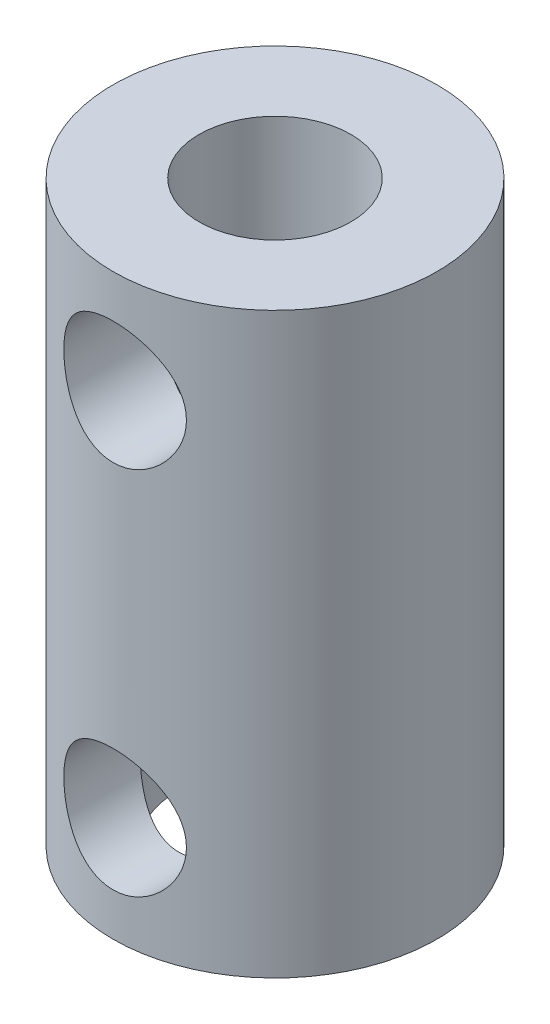
ISO-10303-21;
HEADER;
FILE_DESCRIPTION(('STEP AP214'),'2;1');
FILE_NAME('part.step','',(''),(''),'','','');
FILE_SCHEMA(('AUTOMOTIVE_DESIGN { 1 0 10303 214 1 1 1 1 }'));
ENDSEC;
DATA;
#1=APPLICATION_CONTEXT('core data for automotive mechanical design processes');
#2=APPLICATION_PROTOCOL_DEFINITION('international standard','automotive_design',2000,#1);
#3=PRODUCT_CONTEXT('',#1,'mechanical');
#4=PRODUCT('Part','Part','',(#3));
#5=PRODUCT_RELATED_PRODUCT_CATEGORY('part','',(#4));
#6=PRODUCT_DEFINITION_FORMATION('','',#4);
#7=PRODUCT_DEFINITION_CONTEXT('part definition',#1,'design');
#8=PRODUCT_DEFINITION('design','',#6,#7);
#9=PRODUCT_DEFINITION_SHAPE('','',#8);
#10=(LENGTH_UNIT() NAMED_UNIT(*) SI_UNIT(.MILLI.,.METRE.));
#11=(NAMED_UNIT(*) PLANE_ANGLE_UNIT() SI_UNIT($,.RADIAN.));
#12=(NAMED_UNIT(*) SI_UNIT($,.STERADIAN.) SOLID_ANGLE_UNIT());
#13=UNCERTAINTY_MEASURE_WITH_UNIT(LENGTH_MEASURE(1.E-05),#10,'distance_accuracy_value','');
#14=(GEOMETRIC_REPRESENTATION_CONTEXT(3) GLOBAL_UNCERTAINTY_ASSIGNED_CONTEXT((#13)) GLOBAL_UNIT_ASSIGNED_CONTEXT((#10,
#11,#12)) REPRESENTATION_CONTEXT('',''));
#15=CARTESIAN_POINT('',(0.,0.,0.));
#16=DIRECTION('',(0.,0.,1.));
#17=DIRECTION('',(1.,0.,0.));
#18=AXIS2_PLACEMENT_3D('',#15,#16,#17);
#19=CARTESIAN_POINT('',(0.,19.05,0.));
#20=DIRECTION('',(0.,-1.,0.));
#21=DIRECTION('',(0.,0.,-1.));
#22=AXIS2_PLACEMENT_3D('',#19,#20,#21);
#23=CYLINDRICAL_SURFACE('',#22,5.334);
#24=CARTESIAN_POINT('',(2.01929999999999,3.429,4.93700146951568));
#25=CARTESIAN_POINT('',(2.01930447944565,3.53796644205671,4.93699724405046));
#26=CARTESIAN_POINT('',(2.01045059439056,3.64690370553361,4.94064814854933));
#27=CARTESIAN_POINT('',(1.97543444054489,3.86148882864372,4.95475201963925));
#28=CARTESIAN_POINT('',(1.94927294682313,3.96713683535452,4.96520468163385));
#29=CARTESIAN_POINT('',(1.88074304619809,4.17198278347489,4.99156194094386));
#30=CARTESIAN_POINT('',(1.83841414033231,4.2711957615293,5.00745324054417));
#31=CARTESIAN_POINT('',(1.73889128334471,4.46115102344321,5.04287560500619));
#32=CARTESIAN_POINT('',(1.6816927775262,4.55189070025616,5.06240778458365));
#33=CARTESIAN_POINT('',(1.55095007886271,4.7269220295397,5.10401994332031));
#34=CARTESIAN_POINT('',(1.47677408325426,4.81072382075372,5.12617585427608));
#35=CARTESIAN_POINT('',(1.31552180232292,4.96504478705856,5.16990629793248));
#36=CARTESIAN_POINT('',(1.2284427045076,5.0355610586704,5.19148070266726));
#37=CARTESIAN_POINT('',(1.04012523794396,5.16368183766763,5.23252204526852));
#38=CARTESIAN_POINT('',(0.938499803257827,5.22075210244006,5.25188961400418));
#39=CARTESIAN_POINT('',(0.726227423158126,5.31678227445568,5.28542063488425));
#40=CARTESIAN_POINT('',(0.615583687488662,5.35574859235797,5.29958592879611));
#41=CARTESIAN_POINT('',(0.393566749542693,5.41274137724498,5.32057718322424));
#42=CARTESIAN_POINT('',(0.282438553669896,5.43161158643117,5.32769789450095));
#43=CARTESIAN_POINT('',(0.0583798398278733,5.45058184692518,5.33485652895422));
#44=CARTESIAN_POINT('',(-0.0545500684528993,5.45068811853213,5.33489679931724));
#45=CARTESIAN_POINT('',(-0.272951762873949,5.43261481136873,5.32807636219454));
#46=CARTESIAN_POINT('',(-0.378512558081566,5.41535666378981,5.32156339727964));
#47=CARTESIAN_POINT('',(-0.585111251091154,5.36459681820008,5.30282614548131));
#48=CARTESIAN_POINT('',(-0.686148827388547,5.33109396753274,5.29060145331974));
#49=CARTESIAN_POINT('',(-0.882591199788239,5.24837714092316,5.26142589156488));
#50=CARTESIAN_POINT('',(-0.977891853376849,5.19894029486581,5.24440843901689));
#51=CARTESIAN_POINT('',(-1.15908281530852,5.08595760716204,5.20736477295068));
#52=CARTESIAN_POINT('',(-1.24497004337341,5.02240716770396,5.18733757963256));
#53=CARTESIAN_POINT('',(-1.41031734945089,4.87858128309122,5.14492730665769));
#54=CARTESIAN_POINT('',(-1.48909060289719,4.79753549367529,5.12247495361345));
#55=CARTESIAN_POINT('',(-1.63218972233639,4.62325577623301,5.07869327063848));
#56=CARTESIAN_POINT('',(-1.69651181554814,4.53001867543433,5.05736423508365));
#57=CARTESIAN_POINT('',(-1.81023010786301,4.33124303399592,5.01780263958016));
#58=CARTESIAN_POINT('',(-1.85924901990288,4.22547089829707,4.99965257367589));
#59=CARTESIAN_POINT('',(-1.93851753880741,4.00630460921826,4.96945937974622));
#60=CARTESIAN_POINT('',(-1.96877783080307,3.89291483581017,4.95741277583277));
#61=CARTESIAN_POINT('',(-2.0080927254921,3.66852916571396,4.94161372576153));
#62=CARTESIAN_POINT('',(-2.01824049485177,3.55775511724918,4.93743437273379));
#63=CARTESIAN_POINT('',(-2.02020093934924,3.33603239846786,4.93663342024542));
#64=CARTESIAN_POINT('',(-2.01201832383527,3.22508378031911,4.94000987958409));
#65=CARTESIAN_POINT('',(-1.97854205652086,3.01183186914766,4.95350589275915));
#66=CARTESIAN_POINT('',(-1.95410194104481,2.90937078397479,4.96328872527596));
#67=CARTESIAN_POINT('',(-1.88988298600506,2.71005348440489,4.98809328378995));
#68=CARTESIAN_POINT('',(-1.85010096750629,2.61319843639933,5.00311609548081));
#69=CARTESIAN_POINT('',(-1.75463072385412,2.42375373533398,5.03740860205377));
#70=CARTESIAN_POINT('',(-1.69839621410485,2.3314653892027,5.05681781536739));
#71=CARTESIAN_POINT('',(-1.57219523321136,2.15724747101338,5.09746480725639));
#72=CARTESIAN_POINT('',(-1.50222365366067,2.07532177120689,5.11870326441882));
#73=CARTESIAN_POINT('',(-1.34516894631352,1.91864380219287,5.16227937258415));
#74=CARTESIAN_POINT('',(-1.25727058071108,1.84470087388889,5.18459902436317));
#75=CARTESIAN_POINT('',(-1.06976739053702,1.71251372859965,5.22650650196036));
#76=CARTESIAN_POINT('',(-0.970162473418255,1.65426963573486,5.24609430617899));
#77=CARTESIAN_POINT('',(-0.762084546055993,1.55549649159357,5.28032694944767));
#78=CARTESIAN_POINT('',(-0.65363967819728,1.51491364331945,5.29498676788628));
#79=CARTESIAN_POINT('',(-0.430779322695874,1.45280032542776,5.31775366325145));
#80=CARTESIAN_POINT('',(-0.316366729446474,1.43126070903253,5.32586388589443));
#81=CARTESIAN_POINT('',(-0.0921269840688143,1.40884562792458,5.33431446661301));
#82=CARTESIAN_POINT('',(0.0175700260696666,1.40682107157147,5.33508685186249));
#83=CARTESIAN_POINT('',(0.23567589035579,1.42052681410102,5.32990684279753));
#84=CARTESIAN_POINT('',(0.344084903230242,1.43625490180729,5.32395528598201));
#85=CARTESIAN_POINT('',(0.553754325491232,1.48421010250464,5.3061959436016));
#86=CARTESIAN_POINT('',(0.655126105044459,1.5160107376975,5.29453976881732));
#87=CARTESIAN_POINT('',(0.851099804673821,1.594780504935,5.26659215506921));
#88=CARTESIAN_POINT('',(0.945700438435498,1.64175250979098,5.2502998382871));
#89=CARTESIAN_POINT('',(1.12984126460486,1.75179421046231,5.21384686801513));
#90=CARTESIAN_POINT('',(1.21899691290268,1.81546192263802,5.19355150342232));
#91=CARTESIAN_POINT('',(1.38571137675006,1.9561510808879,5.15157869080139));
#92=CARTESIAN_POINT('',(1.46326600313846,2.03317732918966,5.1299007475314));
#93=CARTESIAN_POINT('',(1.60889417238222,2.20334295835456,5.08616858438968));
#94=CARTESIAN_POINT('',(1.67622898493519,2.29712810269221,5.06415732477682));
#95=CARTESIAN_POINT('',(1.79422016325732,2.49537615296483,5.02356822261871));
#96=CARTESIAN_POINT('',(1.84487417660335,2.59984056223187,5.0049908645041));
#97=CARTESIAN_POINT('',(1.92989734602869,2.82239312636753,4.97285117373348));
#98=CARTESIAN_POINT('',(1.96328114135574,2.94090744590317,4.9596003647767));
#99=CARTESIAN_POINT('',(2.00797225124147,3.18262915575414,4.94168088836879));
#100=CARTESIAN_POINT('',(2.01929493679981,3.30583321744351,4.93700624563709));
#101=CARTESIAN_POINT('',(2.01929999999999,3.429,4.93700146951568));
#102=B_SPLINE_CURVE_WITH_KNOTS('',3,(#24,#25,#26,#27,#28,#29,#30,#31,#32,#33,#34,#35,#36,#37,
#38,#39,#40,#41,#42,#43,#44,#45,#46,#47,#48,#49,#50,#51,#52,#53,#54,#55,#56,#57,#58,#59,#60,#61,
#62,#63,#64,#65,#66,#67,#68,#69,#70,#71,#72,#73,#74,#75,#76,#77,#78,#79,#80,#81,#82,#83,#84,#85,
#86,#87,#88,#89,#90,#91,#92,#93,#94,#95,#96,#97,#98,#99,#100,#101),.UNSPECIFIED.,.T.,.F.,(4,2,2,
2,2,2,2,2,2,2,2,2,2,2,2,2,2,2,2,2,2,2,2,2,2,2,2,2,2,2,2,2,2,2,2,2,2,2,4),(0.,0.326440462933104,
0.652866308208239,0.97849966296616,1.30423288001533,1.64497726295524,1.98579602758814,
2.33846601182069,2.69101101924979,3.02808777213957,3.36505278290879,3.68503301877184,
4.00503596242417,4.32972461584071,4.65451919925019,4.99864582719999,5.34286219255829,
5.69499486283583,6.0469267694459,6.37913973630183,6.71126736249901,7.02720512429604,
7.34320838551137,7.67120245546789,7.99931872846166,8.3487060328166,8.69809609946859,
9.04641432838319,9.39456516328478,9.72208120206034,10.0495564516543,10.3687657960398,
10.6880356205532,11.0208403418839,11.3537649513074,11.7046787209908,12.0556419573988,
12.4248810015916,12.793862687667),.UNSPECIFIED.);
#103=CARTESIAN_POINT('',(2.01929999999999,3.429,4.93700146951568));
#104=VERTEX_POINT('',#103);
#105=EDGE_CURVE('E143',#104,#104,#102,.T.);
#106=ORIENTED_EDGE('',*,*,#105,.F.);
#107=EDGE_LOOP('',(#106));
#108=FACE_BOUND('',#107,.T.);
#109=CARTESIAN_POINT('',(2.01929999999999,15.621,4.93700146951568));
#110=CARTESIAN_POINT('',(2.01930447944565,15.7299664420567,4.93699724405046));
#111=CARTESIAN_POINT('',(2.01045059439056,15.8389037055336,4.94064814854933));
#112=CARTESIAN_POINT('',(1.97543444054489,16.0534888286437,4.95475201963925));
#113=CARTESIAN_POINT('',(1.94927294682313,16.1591368353545,4.96520468163385));
#114=CARTESIAN_POINT('',(1.88074304619809,16.3639827834749,4.99156194094386));
#115=CARTESIAN_POINT('',(1.83841414033231,16.4631957615293,5.00745324054417));
#116=CARTESIAN_POINT('',(1.73889128334471,16.6531510234432,5.04287560500619));
#117=CARTESIAN_POINT('',(1.68169277752621,16.7438907002562,5.06240778458365));
#118=CARTESIAN_POINT('',(1.55095007886271,16.9189220295397,5.1040199433203));
#119=CARTESIAN_POINT('',(1.47677408325426,17.0027238207537,5.12617585427608));
#120=CARTESIAN_POINT('',(1.31552180232293,17.1570447870586,5.16990629793248));
#121=CARTESIAN_POINT('',(1.22844270450761,17.2275610586704,5.19148070266726));
#122=CARTESIAN_POINT('',(1.04012523794396,17.3556818376676,5.23252204526852));
#123=CARTESIAN_POINT('',(0.938499803257828,17.4127521024401,5.25188961400418));
#124=CARTESIAN_POINT('',(0.726227423158127,17.5087822744557,5.28542063488425));
#125=CARTESIAN_POINT('',(0.615583687488664,17.547748592358,5.29958592879611));
#126=CARTESIAN_POINT('',(0.393566749542695,17.604741377245,5.32057718322424));
#127=CARTESIAN_POINT('',(0.282438553669898,17.6236115864312,5.32769789450094));
#128=CARTESIAN_POINT('',(0.0583798398278744,17.6425818469252,5.33485652895422));
#129=CARTESIAN_POINT('',(-0.0545500684528987,17.6426881185321,5.33489679931724));
#130=CARTESIAN_POINT('',(-0.272951762873949,17.6246148113687,5.32807636219454));
#131=CARTESIAN_POINT('',(-0.378512558081566,17.6073566637898,5.32156339727964));
#132=CARTESIAN_POINT('',(-0.585111251091155,17.5565968182001,5.30282614548131));
#133=CARTESIAN_POINT('',(-0.686148827388547,17.5230939675327,5.29060145331974));
#134=CARTESIAN_POINT('',(-0.882591199788239,17.4403771409232,5.26142589156488));
#135=CARTESIAN_POINT('',(-0.977891853376849,17.3909402948658,5.24440843901689));
#136=CARTESIAN_POINT('',(-1.15908281530852,17.277957607162,5.20736477295068));
#137=CARTESIAN_POINT('',(-1.24497004337341,17.214407167704,5.18733757963256));
#138=CARTESIAN_POINT('',(-1.41031734945089,17.0705812830912,5.14492730665769));
#139=CARTESIAN_POINT('',(-1.48909060289719,16.9895354936753,5.12247495361345));
#140=CARTESIAN_POINT('',(-1.63218972233639,16.815255776233,5.07869327063848));
#141=CARTESIAN_POINT('',(-1.69651181554814,16.7220186754343,5.05736423508365));
#142=CARTESIAN_POINT('',(-1.81023010786301,16.5232430339959,5.01780263958016));
#143=CARTESIAN_POINT('',(-1.85924901990288,16.4174708982971,4.99965257367589));
#144=CARTESIAN_POINT('',(-1.93851753880741,16.1983046092183,4.96945937974622));
#145=CARTESIAN_POINT('',(-1.96877783080307,16.0849148358102,4.95741277583277));
#146=CARTESIAN_POINT('',(-2.0080927254921,15.860529165714,4.94161372576153));
#147=CARTESIAN_POINT('',(-2.01824049485177,15.7497551172492,4.93743437273379));
#148=CARTESIAN_POINT('',(-2.02020093934924,15.5280323984679,4.93663342024542));
#149=CARTESIAN_POINT('',(-2.01201832383527,15.4170837803191,4.94000987958409));
#150=CARTESIAN_POINT('',(-1.97854205652086,15.2038318691477,4.95350589275915));
#151=CARTESIAN_POINT('',(-1.95410194104481,15.1013707839748,4.96328872527596));
#152=CARTESIAN_POINT('',(-1.88988298600506,14.9020534844049,4.98809328378994));
#153=CARTESIAN_POINT('',(-1.85010096750629,14.8051984363993,5.00311609548081));
#154=CARTESIAN_POINT('',(-1.75463072385412,14.615753735334,5.03740860205377));
#155=CARTESIAN_POINT('',(-1.69839621410485,14.5234653892027,5.05681781536739));
#156=CARTESIAN_POINT('',(-1.57219523321136,14.3492474710134,5.09746480725639));
#157=CARTESIAN_POINT('',(-1.50222365366067,14.2673217712069,5.11870326441882));
#158=CARTESIAN_POINT('',(-1.34516894631352,14.1106438021929,5.16227937258415));
#159=CARTESIAN_POINT('',(-1.25727058071108,14.0367008738889,5.18459902436317));
#160=CARTESIAN_POINT('',(-1.06976739053702,13.9045137285996,5.22650650196036));
#161=CARTESIAN_POINT('',(-0.970162473418255,13.8462696357349,5.24609430617899));
#162=CARTESIAN_POINT('',(-0.762084546055994,13.7474964915936,5.28032694944767));
#163=CARTESIAN_POINT('',(-0.65363967819728,13.7069136433194,5.29498676788628));
#164=CARTESIAN_POINT('',(-0.430779322695874,13.6448003254278,5.31775366325145));
#165=CARTESIAN_POINT('',(-0.316366729446474,13.6232607090325,5.32586388589443));
#166=CARTESIAN_POINT('',(-0.0921269840688128,13.6008456279246,5.33431446661301));
#167=CARTESIAN_POINT('',(0.0175700260696684,13.5988210715715,5.33508685186249));
#168=CARTESIAN_POINT('',(0.235675890355791,13.612526814101,5.32990684279753));
#169=CARTESIAN_POINT('',(0.344084903230242,13.6282549018073,5.32395528598201));
#170=CARTESIAN_POINT('',(0.553754325491233,13.6762101025046,5.3061959436016));
#171=CARTESIAN_POINT('',(0.655126105044461,13.7080107376975,5.29453976881732));
#172=CARTESIAN_POINT('',(0.851099804673823,13.786780504935,5.26659215506921));
#173=CARTESIAN_POINT('',(0.945700438435499,13.833752509791,5.2502998382871));
#174=CARTESIAN_POINT('',(1.12984126460486,13.9437942104623,5.21384686801513));
#175=CARTESIAN_POINT('',(1.21899691290268,14.007461922638,5.19355150342232));
#176=CARTESIAN_POINT('',(1.38571137675006,14.1481510808879,5.15157869080139));
#177=CARTESIAN_POINT('',(1.46326600313847,14.2251773291897,5.1299007475314));
#178=CARTESIAN_POINT('',(1.60889417238223,14.3953429583546,5.08616858438968));
#179=CARTESIAN_POINT('',(1.67622898493519,14.4891281026922,5.06415732477682));
#180=CARTESIAN_POINT('',(1.79422016325732,14.6873761529648,5.02356822261871));
#181=CARTESIAN_POINT('',(1.84487417660335,14.7918405622319,5.0049908645041));
#182=CARTESIAN_POINT('',(1.92989734602869,15.0143931263675,4.97285117373348));
#183=CARTESIAN_POINT('',(1.96328114135574,15.1329074459032,4.9596003647767));
#184=CARTESIAN_POINT('',(2.00797225124147,15.3746291557541,4.94168088836879));
#185=CARTESIAN_POINT('',(2.01929493679981,15.4978332174435,4.93700624563709));
#186=CARTESIAN_POINT('',(2.01929999999999,15.621,4.93700146951568));
#187=B_SPLINE_CURVE_WITH_KNOTS('',3,(#109,#110,#111,#112,#113,#114,#115,#116,#117,#118,#119,
#120,#121,#122,#123,#124,#125,#126,#127,#128,#129,#130,#131,#132,#133,#134,#135,#136,#137,#138,
#139,#140,#141,#142,#143,#144,#145,#146,#147,#148,#149,#150,#151,#152,#153,#154,#155,#156,#157,
#158,#159,#160,#161,#162,#163,#164,#165,#166,#167,#168,#169,#170,#171,#172,#173,#174,#175,#176,
#177,#178,#179,#180,#181,#182,#183,#184,#185,#186),.UNSPECIFIED.,.T.,.F.,(4,2,2,2,2,2,2,2,2,2,2,
2,2,2,2,2,2,2,2,2,2,2,2,2,2,2,2,2,2,2,2,2,2,2,2,2,2,2,4),(0.,0.326440462933099,
0.652866308208239,0.978499662966158,1.30423288001532,1.64497726295524,1.98579602758814,
2.33846601182068,2.69101101924979,3.02808777213956,3.36505278290879,3.68503301877184,
4.00503596242417,4.32972461584071,4.65451919925019,4.99864582719999,5.34286219255829,
5.69499486283583,6.04692676944589,6.37913973630183,6.71126736249901,7.02720512429604,
7.34320838551137,7.6712024554679,7.99931872846166,8.3487060328166,8.69809609946859,
9.04641432838319,9.39456516328478,9.72208120206034,10.0495564516543,10.3687657960398,
10.6880356205532,11.0208403418839,11.3537649513074,11.7046787209908,12.0556419573988,
12.4248810015916,12.793862687667),.UNSPECIFIED.);
#188=CARTESIAN_POINT('',(2.01929999999999,15.621,4.93700146951568));
#189=VERTEX_POINT('',#188);
#190=EDGE_CURVE('E82',#189,#189,#187,.T.);
#191=ORIENTED_EDGE('',*,*,#190,.F.);
#192=EDGE_LOOP('',(#191));
#193=FACE_BOUND('',#192,.T.);
#194=CARTESIAN_POINT('',(0.,19.05,0.));
#195=DIRECTION('',(0.,-1.,0.));
#196=DIRECTION('',(0.,0.,-1.));
#197=AXIS2_PLACEMENT_3D('',#194,#195,#196);
#198=CIRCLE('',#197,5.334);
#199=CARTESIAN_POINT('',(0.,19.05,-5.334));
#200=VERTEX_POINT('',#199);
#201=EDGE_CURVE('E12',#200,#200,#198,.T.);
#202=ORIENTED_EDGE('',*,*,#201,.T.);
#203=EDGE_LOOP('',(#202));
#204=FACE_BOUND('',#203,.T.);
#205=CARTESIAN_POINT('',(0.,0.,0.));
#206=DIRECTION('',(0.,-1.,0.));
#207=DIRECTION('',(0.,0.,-1.));
#208=AXIS2_PLACEMENT_3D('',#205,#206,#207);
#209=CIRCLE('',#208,5.334);
#210=CARTESIAN_POINT('',(0.,0.,-5.334));
#211=VERTEX_POINT('',#210);
#212=EDGE_CURVE('E58',#211,#211,#209,.T.);
#213=ORIENTED_EDGE('',*,*,#212,.F.);
#214=EDGE_LOOP('',(#213));
#215=FACE_BOUND('',#214,.T.);
#216=ADVANCED_FACE('F50',(#108,#193,#204,#215),#23,.T.);
#217=CARTESIAN_POINT('',(5.334,19.05,0.));
#218=DIRECTION('',(0.,1.,0.));
#219=DIRECTION('',(0.,0.,1.));
#220=AXIS2_PLACEMENT_3D('',#217,#218,#219);
#221=PLANE('',#220);
#222=CARTESIAN_POINT('',(0.,19.05,0.));
#223=DIRECTION('',(0.,-1.,0.));
#224=DIRECTION('',(0.,0.,-1.));
#225=AXIS2_PLACEMENT_3D('',#222,#223,#224);
#226=CIRCLE('',#225,2.5);
#227=CARTESIAN_POINT('',(0.,19.05,-2.5));
#228=VERTEX_POINT('',#227);
#229=EDGE_CURVE('E65',#228,#228,#226,.T.);
#230=ORIENTED_EDGE('',*,*,#229,.T.);
#231=EDGE_LOOP('',(#230));
#232=FACE_BOUND('',#231,.T.);
#233=ORIENTED_EDGE('',*,*,#201,.F.);
#234=EDGE_LOOP('',(#233));
#235=FACE_BOUND('',#234,.T.);
#236=ADVANCED_FACE('F120',(#232,#235),#221,.T.);
#237=CARTESIAN_POINT('',(0.,0.,0.));
#238=DIRECTION('',(0.,-1.,0.));
#239=DIRECTION('',(0.,0.,-1.));
#240=AXIS2_PLACEMENT_3D('',#237,#238,#239);
#241=PLANE('',#240);
#242=CARTESIAN_POINT('',(0.,0.,0.));
#243=DIRECTION('',(0.,-1.,0.));
#244=DIRECTION('',(0.,0.,-1.));
#245=AXIS2_PLACEMENT_3D('',#242,#243,#244);
#246=CIRCLE('',#245,3.17499999999999);
#247=CARTESIAN_POINT('',(0.,0.,-3.17499999999999));
#248=VERTEX_POINT('',#247);
#249=EDGE_CURVE('E79',#248,#248,#246,.T.);
#250=ORIENTED_EDGE('',*,*,#249,.F.);
#251=EDGE_LOOP('',(#250));
#252=FACE_BOUND('',#251,.T.);
#253=ORIENTED_EDGE('',*,*,#212,.T.);
#254=EDGE_LOOP('',(#253));
#255=FACE_BOUND('',#254,.T.);
#256=ADVANCED_FACE('F117',(#252,#255),#241,.T.);
#257=CARTESIAN_POINT('',(0.,0.,0.));
#258=DIRECTION('',(0.,-1.,0.));
#259=DIRECTION('',(0.,0.,-1.));
#260=AXIS2_PLACEMENT_3D('',#257,#258,#259);
#261=CYLINDRICAL_SURFACE('',#260,2.50000000000001);
#262=CARTESIAN_POINT('',(2.01929999999999,15.621,1.47391570654501));
#263=CARTESIAN_POINT('',(2.01929480722155,15.695817152673,1.47392817298036));
#264=CARTESIAN_POINT('',(2.01509305438287,15.770758738327,1.47973177177316));
#265=CARTESIAN_POINT('',(1.99869205773919,15.9182527876197,1.50179953959201));
#266=CARTESIAN_POINT('',(1.98646694346137,15.9907967228186,1.51809754348625));
#267=CARTESIAN_POINT('',(1.9492780717501,16.1572237109829,1.56572883433403));
#268=CARTESIAN_POINT('',(1.92132304975766,16.2494666351095,1.60035394837302));
#269=CARTESIAN_POINT('',(1.85422314092621,16.4262492339265,1.67764101224755));
#270=CARTESIAN_POINT('',(1.81504489951149,16.5107649412816,1.72032678694469));
#271=CARTESIAN_POINT('',(1.74026753050541,16.647187087901,1.79536950883742));
#272=CARTESIAN_POINT('',(1.70732483369805,16.7010795548549,1.82682556730138));
#273=CARTESIAN_POINT('',(1.63673711570053,16.8053275734456,1.8903305612507));
#274=CARTESIAN_POINT('',(1.59909033781284,16.8556817927219,1.92237971439296));
#275=CARTESIAN_POINT('',(1.4792654443613,17.0012662951321,2.017961614084));
#276=CARTESIAN_POINT('',(1.39008353685323,17.0912350977392,2.08105533247437));
#277=CARTESIAN_POINT('',(1.2133292385467,17.2383523323418,2.18775655279473));
#278=CARTESIAN_POINT('',(1.12903037750066,17.2984634128109,2.23273276258079));
#279=CARTESIAN_POINT('',(0.949376709043425,17.4062687543222,2.31481868022346));
#280=CARTESIAN_POINT('',(0.854039558710226,17.4539824603778,2.35194069002828));
#281=CARTESIAN_POINT('',(0.670326271498939,17.527925581788,2.41005502549929));
#282=CARTESIAN_POINT('',(0.583378644426078,17.5563965314886,2.43269514678688));
#283=CARTESIAN_POINT('',(0.404602004181707,17.6014921566258,2.46872242982194));
#284=CARTESIAN_POINT('',(0.312775724850326,17.618123392964,2.48211471607454));
#285=CARTESIAN_POINT('',(0.12642699280287,17.6385236671229,2.4985580350246));
#286=CARTESIAN_POINT('',(0.0318960123591571,17.6422461116475,2.50157160627638));
#287=CARTESIAN_POINT('',(-0.156486173102201,17.6364316376802,2.49687588189193));
#288=CARTESIAN_POINT('',(-0.250337360108225,17.626894369145,2.48916630317513));
#289=CARTESIAN_POINT('',(-0.429140532047279,17.5961390241307,2.46445221174764));
#290=CARTESIAN_POINT('',(-0.514294277979385,17.5756217271112,2.44800573548022));
#291=CARTESIAN_POINT('',(-0.679541017418279,17.5244927412796,2.40737862535811));
#292=CARTESIAN_POINT('',(-0.7596327059186,17.4938784619963,2.38319600677466));
#293=CARTESIAN_POINT('',(-0.920770446303678,17.4205321075079,2.32597640251123));
#294=CARTESIAN_POINT('',(-1.00119655018714,17.3769305807205,2.29232018371873));
#295=CARTESIAN_POINT('',(-1.153695056202,17.2807292583919,2.21949122380963));
#296=CARTESIAN_POINT('',(-1.22576310006027,17.2281248033922,2.18031562800905));
#297=CARTESIAN_POINT('',(-1.37523874956472,17.1034407160834,2.08993667695685));
#298=CARTESIAN_POINT('',(-1.45066899230469,17.0295832657084,2.03792128952946));
#299=CARTESIAN_POINT('',(-1.58880440740247,16.8717195492242,1.9321670528221));
#300=CARTESIAN_POINT('',(-1.65149250594816,16.7876999034864,1.87842600138098));
#301=CARTESIAN_POINT('',(-1.75958628758068,16.6164495324485,1.77733312807007));
#302=CARTESIAN_POINT('',(-1.80592689536945,16.5299151636252,1.72980265406421));
#303=CARTESIAN_POINT('',(-1.8864585351309,16.348110486566,1.64159022044208));
#304=CARTESIAN_POINT('',(-1.92067607919658,16.2528598218056,1.60089342007614));
#305=CARTESIAN_POINT('',(-1.96632640337569,16.0857790923626,1.54416456673684));
#306=CARTESIAN_POINT('',(-1.98154800109557,16.0162803084664,1.52440993985532));
#307=CARTESIAN_POINT('',(-2.00464734514039,15.8742077176853,1.4939085692843));
#308=CARTESIAN_POINT('',(-2.01254234645966,15.8016415588115,1.48314066686153));
#309=CARTESIAN_POINT('',(-2.02036345833571,15.6547431789786,1.47247617440034));
#310=CARTESIAN_POINT('',(-2.02023580156782,15.5804023808004,1.47265293465197));
#311=CARTESIAN_POINT('',(-2.01188939337809,15.4330009922396,1.48402871659748));
#312=CARTESIAN_POINT('',(-2.00365994622032,15.3599422241304,1.49524230877441));
#313=CARTESIAN_POINT('',(-1.97703934818401,15.2004318643912,1.53032338883688));
#314=CARTESIAN_POINT('',(-1.95672334209332,15.1148389545399,1.55653509298973));
#315=CARTESIAN_POINT('',(-1.90644977534374,14.9497980369191,1.61771969357757));
#316=CARTESIAN_POINT('',(-1.87646281040626,14.8703696980278,1.65271923638022));
#317=CARTESIAN_POINT('',(-1.79115590372931,14.6803121833082,1.74568689316358));
#318=CARTESIAN_POINT('',(-1.73061991204155,14.5734334484584,1.80651395789614));
#319=CARTESIAN_POINT('',(-1.59198575897705,14.3727918475522,1.92983341880176));
#320=CARTESIAN_POINT('',(-1.51386486189692,14.2790462182822,1.99232787773045));
#321=CARTESIAN_POINT('',(-1.33868834736263,14.104066758993,2.1141237030724));
#322=CARTESIAN_POINT('',(-1.24130762020883,14.0230980313765,2.17334407438492));
#323=CARTESIAN_POINT('',(-1.02924522725081,13.8790096958363,2.28138266596993));
#324=CARTESIAN_POINT('',(-0.914620369699268,13.8158333667187,2.33023381719762));
#325=CARTESIAN_POINT('',(-0.709566917792893,13.7283170012323,2.3987919083807));
#326=CARTESIAN_POINT('',(-0.623112377750111,13.6980179447815,2.42282352422953));
#327=CARTESIAN_POINT('',(-0.444963359276088,13.6491772827753,2.46176594276953));
#328=CARTESIAN_POINT('',(-0.353272974959091,13.6306266242872,2.47668376793679));
#329=CARTESIAN_POINT('',(-0.166706055375663,13.6063874966507,2.49620492264458));
#330=CARTESIAN_POINT('',(-0.0718178514248777,13.6007528608993,2.50076508118314));
#331=CARTESIAN_POINT('',(0.117708056155674,13.6029078703976,2.49902432329807));
#332=CARTESIAN_POINT('',(0.212345760997416,13.6106974505783,2.49272345951928));
#333=CARTESIAN_POINT('',(0.392478798314731,13.6382447811681,2.47056373925411));
#334=CARTESIAN_POINT('',(0.47817506063123,13.6572203267739,2.45532988066348));
#335=CARTESIAN_POINT('',(0.644740829759777,13.7054305181875,2.41694473259869));
#336=CARTESIAN_POINT('',(0.725609068995021,13.734667844443,2.39379137453718));
#337=CARTESIAN_POINT('',(0.887671111373454,13.8049454071109,2.33879505673712));
#338=CARTESIAN_POINT('',(0.968331731435914,13.8467655117114,2.30638921826432));
#339=CARTESIAN_POINT('',(1.12154463098483,13.9394123343552,2.23590280226767));
#340=CARTESIAN_POINT('',(1.19409338451913,13.9902429443311,2.19781977371435));
#341=CARTESIAN_POINT('',(1.34451441899107,14.1107261746447,2.10981567153515));
#342=CARTESIAN_POINT('',(1.42050802965211,14.1821071927176,2.05905632923989));
#343=CARTESIAN_POINT('',(1.56016448165251,14.334845763169,1.95536659198131));
#344=CARTESIAN_POINT('',(1.62380894191177,14.4162178973091,1.90243310066323));
#345=CARTESIAN_POINT('',(1.73723779994473,14.5866620415423,1.79937292606238));
#346=CARTESIAN_POINT('',(1.78728237313722,14.6755392611519,1.749210793666));
#347=CARTESIAN_POINT('',(1.87436590683737,14.8627524415187,1.65554058689663));
#348=CARTESIAN_POINT('',(1.91142967284722,14.9610698991632,1.61201991196287));
#349=CARTESIAN_POINT('',(1.96080868074273,15.1331873385134,1.55120482828878));
#350=CARTESIAN_POINT('',(1.97725454143049,15.2043911729556,1.52999393395852));
#351=CARTESIAN_POINT('',(2.00240730513944,15.3501629041127,1.49693379349099));
#352=CARTESIAN_POINT('',(2.01114425218012,15.4247165401613,1.48504822393773));
#353=CARTESIAN_POINT('',(2.01687486699648,15.5200111253367,1.47723289234643));
#354=CARTESIAN_POINT('',(2.01778274194707,15.5401738768274,1.47599261432346));
#355=CARTESIAN_POINT('',(2.01899607356419,15.5805547133913,1.47433225023717));
#356=CARTESIAN_POINT('',(2.01930140389357,15.600772809179,1.47391233618196));
#357=CARTESIAN_POINT('',(2.01929999999999,15.621,1.47391570654501));
#358=B_SPLINE_CURVE_WITH_KNOTS('',3,(#262,#263,#264,#265,#266,#267,#268,#269,#270,#271,#272,
#273,#274,#275,#276,#277,#278,#279,#280,#281,#282,#283,#284,#285,#286,#287,#288,#289,#290,#291,
#292,#293,#294,#295,#296,#297,#298,#299,#300,#301,#302,#303,#304,#305,#306,#307,#308,#309,#310,
#311,#312,#313,#314,#315,#316,#317,#318,#319,#320,#321,#322,#323,#324,#325,#326,#327,#328,#329,
#330,#331,#332,#333,#334,#335,#336,#337,#338,#339,#340,#341,#342,#343,#344,#345,#346,#347,#348,
#349,#350,#351,#352,#353,#354,#355,#356,#357),.UNSPECIFIED.,.T.,.F.,(4,2,2,2,2,2,2,2,2,2,2,2,2,
2,2,2,2,2,2,2,2,2,2,2,2,2,2,2,2,2,2,2,2,2,2,2,2,2,2,2,2,2,2,2,2,2,2,4),(0.,0.224362322740664,
0.449451655704625,0.75499047854588,1.06144693177859,1.27288816827714,1.48440860295582,
1.90662570812593,2.24405113823281,2.58094408468372,2.86250451322325,3.1439087951397,
3.42632773306912,3.70875412672087,3.97499404894986,4.24130233062072,4.5326807236232,
4.8242103778679,5.17602246669959,5.52830290218206,5.85454510821447,6.18006938162417,
6.40080279480851,6.62101502570859,6.84270326080861,7.06468455492949,7.33852607700983,
7.61320818271302,8.02229646515855,8.43191673133522,8.84915467219723,9.26504702290814,
9.54802932993571,9.83079331385017,10.1147337188709,10.3986727475979,10.6647829745165,
10.9309627630469,11.2192984509036,11.5077589852118,11.8544132462528,12.2015795916085,
12.5415427910607,12.8808527514879,13.1083575134694,13.3349716520162,13.3956164121122,
13.4562738864078),.UNSPECIFIED.);
#359=CARTESIAN_POINT('',(2.01929999999999,15.621,1.47391570654501));
#360=VERTEX_POINT('',#359);
#361=EDGE_CURVE('E89',#360,#360,#358,.T.);
#362=ORIENTED_EDGE('',*,*,#361,.T.);
#363=EDGE_LOOP('',(#362));
#364=FACE_BOUND('',#363,.T.);
#365=ORIENTED_EDGE('',*,*,#229,.F.);
#366=EDGE_LOOP('',(#365));
#367=FACE_BOUND('',#366,.T.);
#368=CARTESIAN_POINT('',(0.,9.93058091779916,0.));
#369=DIRECTION('',(0.,-1.,0.));
#370=DIRECTION('',(0.,0.,-1.));
#371=AXIS2_PLACEMENT_3D('',#368,#369,#370);
#372=CIRCLE('',#371,2.50000000000001);
#373=CARTESIAN_POINT('',(0.,9.93058091779916,-2.50000000000001));
#374=VERTEX_POINT('',#373);
#375=EDGE_CURVE('E70',#374,#374,#372,.T.);
#376=ORIENTED_EDGE('',*,*,#375,.T.);
#377=EDGE_LOOP('',(#376));
#378=FACE_BOUND('',#377,.T.);
#379=ADVANCED_FACE('F113',(#364,#367,#378),#261,.F.);
#380=CARTESIAN_POINT('',(0.,9.52499999999999,0.));
#381=DIRECTION('',(0.,-1.,0.));
#382=DIRECTION('',(0.,0.,-1.));
#383=AXIS2_PLACEMENT_3D('',#380,#381,#382);
#384=CONICAL_SURFACE('',#383,3.17499999999999,1.029744258725);
#385=ORIENTED_EDGE('',*,*,#375,.F.);
#386=EDGE_LOOP('',(#385));
#387=FACE_BOUND('',#386,.T.);
#388=CARTESIAN_POINT('',(0.,9.52499999999999,0.));
#389=DIRECTION('',(0.,-1.,0.));
#390=DIRECTION('',(0.,0.,-1.));
#391=AXIS2_PLACEMENT_3D('',#388,#389,#390);
#392=CIRCLE('',#391,3.17499999999999);
#393=CARTESIAN_POINT('',(0.,9.52499999999999,-3.17499999999999));
#394=VERTEX_POINT('',#393);
#395=EDGE_CURVE('E76',#394,#394,#392,.T.);
#396=ORIENTED_EDGE('',*,*,#395,.T.);
#397=EDGE_LOOP('',(#396));
#398=FACE_BOUND('',#397,.T.);
#399=ADVANCED_FACE('F109',(#387,#398),#384,.F.);
#400=CARTESIAN_POINT('',(0.,0.,0.));
#401=DIRECTION('',(0.,-1.,0.));
#402=DIRECTION('',(0.,0.,-1.));
#403=AXIS2_PLACEMENT_3D('',#400,#401,#402);
#404=CYLINDRICAL_SURFACE('',#403,3.17499999999999);
#405=CARTESIAN_POINT('',(2.01929999999999,3.429,2.45011275454824));
#406=CARTESIAN_POINT('',(2.01929051569735,3.52894127069753,2.45012817951551));
#407=CARTESIAN_POINT('',(2.01181623998909,3.628972329925,2.45634010720796));
#408=CARTESIAN_POINT('',(1.98248167673375,3.82557968147831,2.48006385016956));
#409=CARTESIAN_POINT('',(1.96059293748517,3.92214874208904,2.49759801227127));
#410=CARTESIAN_POINT('',(1.90403316035159,4.10843627589821,2.5409697869785));
#411=CARTESIAN_POINT('',(1.86947367457506,4.19820652404967,2.56673468951972));
#412=CARTESIAN_POINT('',(1.78888009345359,4.37056455142342,2.62353964875391));
#413=CARTESIAN_POINT('',(1.74284368975069,4.45315088122778,2.65458076625439));
#414=CARTESIAN_POINT('',(1.63312725242593,4.6214415102559,2.72365220953031));
#415=CARTESIAN_POINT('',(1.56788172310624,4.7059732450019,2.76205343085875));
#416=CARTESIAN_POINT('',(1.42479045231801,4.86389017756889,2.83851915466698));
#417=CARTESIAN_POINT('',(1.34693386567764,4.93726567508319,2.87658333731987));
#418=CARTESIAN_POINT('',(1.16891001207363,5.08000661538207,2.95378200389086));
#419=CARTESIAN_POINT('',(1.06716606271611,5.14768834305823,2.99244190742993));
#420=CARTESIAN_POINT('',(0.850805271225738,5.26441857889044,3.06097746101504));
#421=CARTESIAN_POINT('',(0.736201684957568,5.31348605031166,3.09086204386165));
#422=CARTESIAN_POINT('',(0.509994904354268,5.38605734525045,3.13566626418312));
#423=CARTESIAN_POINT('',(0.399328091275863,5.41169558748184,3.15182273437587));
#424=CARTESIAN_POINT('',(0.174221138396403,5.44397014691782,3.17222196724827));
#425=CARTESIAN_POINT('',(0.0597853025568783,5.45062742668431,3.17647787280315));
#426=CARTESIAN_POINT('',(-0.15242412758129,5.44493994541017,3.17286513938983));
#427=CARTESIAN_POINT('',(-0.250305470554214,5.43510476842585,3.16659762255068));
#428=CARTESIAN_POINT('',(-0.442698018208735,5.40159302412571,3.14547384128327));
#429=CARTESIAN_POINT('',(-0.537208968983373,5.37791541632401,3.13061693122205));
#430=CARTESIAN_POINT('',(-0.720612526879302,5.31781504253609,3.09356053401837));
#431=CARTESIAN_POINT('',(-0.809499492488896,5.2813797110953,3.07135380901375));
#432=CARTESIAN_POINT('',(-0.979948739206571,5.19714027782338,3.02129545312327));
#433=CARTESIAN_POINT('',(-1.06150944275225,5.14933373547795,2.99344261064513));
#434=CARTESIAN_POINT('',(-1.22606234754406,5.03694609088178,2.93020696894432));
#435=CARTESIAN_POINT('',(-1.30793132368399,4.97100822513682,2.89431735966663));
#436=CARTESIAN_POINT('',(-1.4601602295923,4.82773303530302,2.82059026986524));
#437=CARTESIAN_POINT('',(-1.53050270668808,4.75037875571948,2.78274994751954));
#438=CARTESIAN_POINT('',(-1.6675094809994,4.57403891610956,2.70316998021408));
#439=CARTESIAN_POINT('',(-1.73234677283065,4.47354168042348,2.66160715287758));
#440=CARTESIAN_POINT('',(-1.84401294040444,4.2606089961782,2.58550168350825));
#441=CARTESIAN_POINT('',(-1.89087460028104,4.14819576286591,2.55094631600008));
#442=CARTESIAN_POINT('',(-1.95422417089592,3.94536060127733,2.50255370083123));
#443=CARTESIAN_POINT('',(-1.97549340596571,3.85717038933682,2.48564302359112));
#444=CARTESIAN_POINT('',(-2.00601072185794,3.67752371563981,2.46108567735712));
#445=CARTESIAN_POINT('',(-2.01527635522342,3.58607222444305,2.45342548274736));
#446=CARTESIAN_POINT('',(-2.02122148552107,3.40221667144573,2.44853180042154));
#447=CARTESIAN_POINT('',(-2.01786621047328,3.30981067847946,2.45132711866524));
#448=CARTESIAN_POINT('',(-1.9987248225326,3.12713534005661,2.46695474139763));
#449=CARTESIAN_POINT('',(-1.98292831962279,3.03686784545298,2.4797954349997));
#450=CARTESIAN_POINT('',(-1.94035603763406,2.86293908196718,2.51323380479193));
#451=CARTESIAN_POINT('',(-1.91385485991129,2.77917087309287,2.53363649039045));
#452=CARTESIAN_POINT('',(-1.85093711433129,2.61710707475903,2.57995729521187));
#453=CARTESIAN_POINT('',(-1.8145172353892,2.53881332378446,2.60587725559256));
#454=CARTESIAN_POINT('',(-1.72468862869318,2.37378481532053,2.66637185156353));
#455=CARTESIAN_POINT('',(-1.66935511652755,2.28835645675552,2.7016501433898));
#456=CARTESIAN_POINT('',(-1.54684224267732,2.12702926072512,2.77361921697771));
#457=CARTESIAN_POINT('',(-1.47964890187627,2.05114185189078,2.81031162521156));
#458=CARTESIAN_POINT('',(-1.32146957597981,1.89750442417588,2.88849831537441));
#459=CARTESIAN_POINT('',(-1.22837765550165,1.82175420866531,2.92970866402264));
#460=CARTESIAN_POINT('',(-1.02843925094222,1.68705670958564,3.00571697609959));
#461=CARTESIAN_POINT('',(-0.921608355915262,1.62809062174493,3.04052210010588));
#462=CARTESIAN_POINT('',(-0.719216299701133,1.53957226245438,3.0938671521323));
#463=CARTESIAN_POINT('',(-0.625687670231274,1.50649343239506,3.11426889307067));
#464=CARTESIAN_POINT('',(-0.433449506453146,1.45426158788784,3.14677961976785));
#465=CARTESIAN_POINT('',(-0.334744157744075,1.43509750336512,3.15889519725593));
#466=CARTESIAN_POINT('',(-0.134549858045073,1.4116616455388,3.1737395780595));
#467=CARTESIAN_POINT('',(-0.0330532251289081,1.4074362316746,3.17643916020349));
#468=CARTESIAN_POINT('',(0.169220717606883,1.41425996732009,3.17210070452944));
#469=CARTESIAN_POINT('',(0.269997958742477,1.42531055621006,3.16506174909832));
#470=CARTESIAN_POINT('',(0.462903169338654,1.46114457582786,3.14250337260815));
#471=CARTESIAN_POINT('',(0.555213410179456,1.48523382787444,3.12741313735221));
#472=CARTESIAN_POINT('',(0.734262324128185,1.54555540013465,3.09028356911828));
#473=CARTESIAN_POINT('',(0.821000087055456,1.58178969808064,3.06824310438061));
#474=CARTESIAN_POINT('',(0.993896475754061,1.66837247564594,3.01687781461151));
#475=CARTESIAN_POINT('',(1.07948239570686,1.71960130435253,2.98711895257936));
#476=CARTESIAN_POINT('',(1.24128256073287,1.8331997608168,2.92359589755362));
#477=CARTESIAN_POINT('',(1.31748906326208,1.89557848984223,2.8898284401059));
#478=CARTESIAN_POINT('',(1.47048578378874,2.04048577966154,2.81541804007873));
#479=CARTESIAN_POINT('',(1.54561455035015,2.12463535064111,2.7745086160117));
#480=CARTESIAN_POINT('',(1.68123983029399,2.30484642528026,2.69448679509776));
#481=CARTESIAN_POINT('',(1.7417327961185,2.40091080844167,2.65537483579391));
#482=CARTESIAN_POINT('',(1.83876550837131,2.58877299516956,2.5889189732656));
#483=CARTESIAN_POINT('',(1.87752281278316,2.67910791563854,2.56069019061928));
#484=CARTESIAN_POINT('',(1.94182185539048,2.86630054967501,2.51228784962042));
#485=CARTESIAN_POINT('',(1.96739877665448,2.9631401097825,2.49209287945082));
#486=CARTESIAN_POINT('',(1.99678820017445,3.12216120028777,2.46853356270055));
#487=CARTESIAN_POINT('',(2.00520384926546,3.18300506264097,2.4616738393758));
#488=CARTESIAN_POINT('',(2.01646293280567,3.30555447596037,2.45245846542435));
#489=CARTESIAN_POINT('',(2.01930585903946,3.36726010500031,2.45010322559335));
#490=CARTESIAN_POINT('',(2.01929999999999,3.429,2.45011275454824));
#491=B_SPLINE_CURVE_WITH_KNOTS('',3,(#405,#406,#407,#408,#409,#410,#411,#412,#413,#414,#415,
#416,#417,#418,#419,#420,#421,#422,#423,#424,#425,#426,#427,#428,#429,#430,#431,#432,#433,#434,
#435,#436,#437,#438,#439,#440,#441,#442,#443,#444,#445,#446,#447,#448,#449,#450,#451,#452,#453,
#454,#455,#456,#457,#458,#459,#460,#461,#462,#463,#464,#465,#466,#467,#468,#469,#470,#471,#472,
#473,#474,#475,#476,#477,#478,#479,#480,#481,#482,#483,#484,#485,#486,#487,#488,#489,#490),
.UNSPECIFIED.,.T.,.F.,(4,2,2,2,2,2,2,2,2,2,2,2,2,2,2,2,2,2,2,2,2,2,2,2,2,2,2,2,2,2,2,2,2,2,2,2,
2,2,2,2,2,2,4),(0.,0.299545346163703,0.599683723262749,0.897240786031993,1.19485774494705,
1.53399780499747,1.87343108015558,2.25583678812834,2.63785186753817,2.97997514749979,
3.32172044011373,3.61602438944011,3.91035046338391,4.20496724691205,4.49964731888725,
4.831591447703,5.16403363102356,5.54206146658145,5.9193965355226,6.19510071677626,
6.47040128648608,6.74646089414033,7.02275129165824,7.29236365357902,7.56206612870596,
7.88405755850047,8.20643108372256,8.58524226804168,8.9636273616455,9.26617640041807,
9.56848447745551,9.87172989295244,10.175003883675,10.4635252097641,10.7520935422965,
11.0631665349708,11.37449461478,11.7329995987663,12.0915913935741,12.3972580961101,
12.7021045844746,12.887135370411,13.0721830298085),.UNSPECIFIED.);
#492=CARTESIAN_POINT('',(2.01929999999999,3.429,2.45011275454824));
#493=VERTEX_POINT('',#492);
#494=EDGE_CURVE('E150',#493,#493,#491,.T.);
#495=ORIENTED_EDGE('',*,*,#494,.T.);
#496=EDGE_LOOP('',(#495));
#497=FACE_BOUND('',#496,.T.);
#498=ORIENTED_EDGE('',*,*,#395,.F.);
#499=EDGE_LOOP('',(#498));
#500=FACE_BOUND('',#499,.T.);
#501=ORIENTED_EDGE('',*,*,#249,.T.);
#502=EDGE_LOOP('',(#501));
#503=FACE_BOUND('',#502,.T.);
#504=ADVANCED_FACE('F100',(#497,#500,#503),#404,.F.);
#505=CARTESIAN_POINT('',(0.,15.621,5.334));
#506=DIRECTION('',(0.,0.,1.));
#507=DIRECTION('',(1.,0.,0.));
#508=AXIS2_PLACEMENT_3D('',#505,#506,#507);
#509=CYLINDRICAL_SURFACE('',#508,2.01929999999999);
#510=ORIENTED_EDGE('',*,*,#190,.T.);
#511=EDGE_LOOP('',(#510));
#512=FACE_BOUND('',#511,.T.);
#513=ORIENTED_EDGE('',*,*,#361,.F.);
#514=EDGE_LOOP('',(#513));
#515=FACE_BOUND('',#514,.T.);
#516=ADVANCED_FACE('F95',(#512,#515),#509,.F.);
#517=CARTESIAN_POINT('',(0.,3.429,5.334));
#518=DIRECTION('',(0.,0.,1.));
#519=DIRECTION('',(1.,0.,0.));
#520=AXIS2_PLACEMENT_3D('',#517,#518,#519);
#521=CYLINDRICAL_SURFACE('',#520,2.01929999999999);
#522=ORIENTED_EDGE('',*,*,#105,.T.);
#523=EDGE_LOOP('',(#522));
#524=FACE_BOUND('',#523,.T.);
#525=ORIENTED_EDGE('',*,*,#494,.F.);
#526=EDGE_LOOP('',(#525));
#527=FACE_BOUND('',#526,.T.);
#528=ADVANCED_FACE('F99',(#524,#527),#521,.F.);
#529=CLOSED_SHELL('',(#216,#236,#256,#379,#399,#504,#516,#528));
#530=MANIFOLD_SOLID_BREP('B2',#529);
#531=ADVANCED_BREP_SHAPE_REPRESENTATION('',(#18,#530),#14);
#532=SHAPE_DEFINITION_REPRESENTATION(#9,#531);
ENDSEC;
END-ISO-10303-21;
